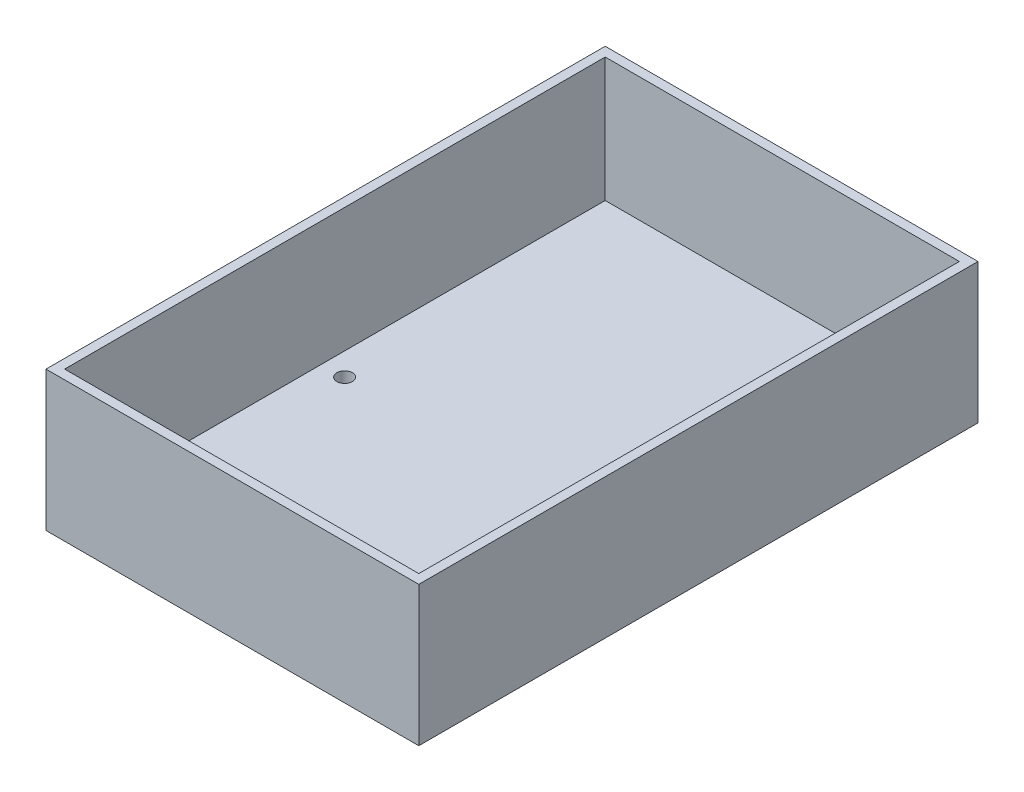
ISO-10303-21;
HEADER;
FILE_DESCRIPTION(('STEP AP214'),'2;1');
FILE_NAME('part.step','',(''),(''),'','','');
FILE_SCHEMA(('AUTOMOTIVE_DESIGN { 1 0 10303 214 1 1 1 1 }'));
ENDSEC;
DATA;
#1=APPLICATION_CONTEXT('core data for automotive mechanical design processes');
#2=APPLICATION_PROTOCOL_DEFINITION('international standard','automotive_design',2000,#1);
#3=PRODUCT_CONTEXT('',#1,'mechanical');
#4=PRODUCT('Part','Part','',(#3));
#5=PRODUCT_RELATED_PRODUCT_CATEGORY('part','',(#4));
#6=PRODUCT_DEFINITION_FORMATION('','',#4);
#7=PRODUCT_DEFINITION_CONTEXT('part definition',#1,'design');
#8=PRODUCT_DEFINITION('design','',#6,#7);
#9=PRODUCT_DEFINITION_SHAPE('','',#8);
#10=(LENGTH_UNIT() NAMED_UNIT(*) SI_UNIT(.MILLI.,.METRE.));
#11=(NAMED_UNIT(*) PLANE_ANGLE_UNIT() SI_UNIT($,.RADIAN.));
#12=(NAMED_UNIT(*) SI_UNIT($,.STERADIAN.) SOLID_ANGLE_UNIT());
#13=UNCERTAINTY_MEASURE_WITH_UNIT(LENGTH_MEASURE(1.E-05),#10,'distance_accuracy_value','');
#14=(GEOMETRIC_REPRESENTATION_CONTEXT(3) GLOBAL_UNCERTAINTY_ASSIGNED_CONTEXT((#13)) GLOBAL_UNIT_ASSIGNED_CONTEXT((#10,
#11,#12)) REPRESENTATION_CONTEXT('',''));
#15=CARTESIAN_POINT('',(0.,0.,0.));
#16=DIRECTION('',(0.,0.,1.));
#17=DIRECTION('',(1.,0.,0.));
#18=AXIS2_PLACEMENT_3D('',#15,#16,#17);
#19=CARTESIAN_POINT('',(0.,45.,0.));
#20=DIRECTION('',(1.,0.,0.));
#21=DIRECTION('',(0.,0.,-1.));
#22=AXIS2_PLACEMENT_3D('',#19,#20,#21);
#23=PLANE('',#22);
#24=DIRECTION('',(0.,0.,1.));
#25=VECTOR('',#24,1.);
#26=CARTESIAN_POINT('',(0.,0.,0.));
#27=LINE('',#26,#25);
#28=CARTESIAN_POINT('',(0.,0.,-180.));
#29=VERTEX_POINT('',#28);
#30=CARTESIAN_POINT('',(0.,0.,0.));
#31=VERTEX_POINT('',#30);
#32=EDGE_CURVE('E150',#29,#31,#27,.T.);
#33=ORIENTED_EDGE('',*,*,#32,.T.);
#34=DIRECTION('',(0.,-1.,0.));
#35=VECTOR('',#34,1.);
#36=CARTESIAN_POINT('',(0.,45.,0.));
#37=LINE('',#36,#35);
#38=CARTESIAN_POINT('',(0.,45.,0.));
#39=VERTEX_POINT('',#38);
#40=EDGE_CURVE('E11',#39,#31,#37,.T.);
#41=ORIENTED_EDGE('',*,*,#40,.F.);
#42=DIRECTION('',(0.,0.,1.));
#43=VECTOR('',#42,1.);
#44=CARTESIAN_POINT('',(0.,45.,0.));
#45=LINE('',#44,#43);
#46=CARTESIAN_POINT('',(0.,45.,-180.));
#47=VERTEX_POINT('',#46);
#48=EDGE_CURVE('E154',#47,#39,#45,.T.);
#49=ORIENTED_EDGE('',*,*,#48,.F.);
#50=DIRECTION('',(0.,-1.,0.));
#51=VECTOR('',#50,1.);
#52=CARTESIAN_POINT('',(0.,45.,-180.));
#53=LINE('',#52,#51);
#54=EDGE_CURVE('E160',#47,#29,#53,.T.);
#55=ORIENTED_EDGE('',*,*,#54,.T.);
#56=EDGE_LOOP('',(#33,#41,#49,#55));
#57=FACE_BOUND('',#56,.T.);
#58=ADVANCED_FACE('F38',(#57),#23,.F.);
#59=CARTESIAN_POINT('',(0.,45.,0.));
#60=DIRECTION('',(0.,0.,-1.));
#61=DIRECTION('',(-1.,0.,0.));
#62=AXIS2_PLACEMENT_3D('',#59,#60,#61);
#63=PLANE('',#62);
#64=DIRECTION('',(1.,0.,0.));
#65=VECTOR('',#64,1.);
#66=CARTESIAN_POINT('',(0.,0.,0.));
#67=LINE('',#66,#65);
#68=CARTESIAN_POINT('',(120.,0.,0.));
#69=VERTEX_POINT('',#68);
#70=EDGE_CURVE('E163',#31,#69,#67,.T.);
#71=ORIENTED_EDGE('',*,*,#70,.T.);
#72=DIRECTION('',(0.,-1.,0.));
#73=VECTOR('',#72,1.);
#74=CARTESIAN_POINT('',(120.,45.,0.));
#75=LINE('',#74,#73);
#76=CARTESIAN_POINT('',(120.,45.,0.));
#77=VERTEX_POINT('',#76);
#78=EDGE_CURVE('E45',#77,#69,#75,.T.);
#79=ORIENTED_EDGE('',*,*,#78,.F.);
#80=DIRECTION('',(1.,0.,0.));
#81=VECTOR('',#80,1.);
#82=CARTESIAN_POINT('',(0.,45.,0.));
#83=LINE('',#82,#81);
#84=EDGE_CURVE('E89',#39,#77,#83,.T.);
#85=ORIENTED_EDGE('',*,*,#84,.F.);
#86=ORIENTED_EDGE('',*,*,#40,.T.);
#87=EDGE_LOOP('',(#71,#79,#85,#86));
#88=FACE_BOUND('',#87,.T.);
#89=ADVANCED_FACE('F192',(#88),#63,.F.);
#90=CARTESIAN_POINT('',(120.,45.,0.));
#91=DIRECTION('',(-1.,0.,0.));
#92=DIRECTION('',(0.,0.,1.));
#93=AXIS2_PLACEMENT_3D('',#90,#91,#92);
#94=PLANE('',#93);
#95=DIRECTION('',(0.,0.,-1.));
#96=VECTOR('',#95,1.);
#97=CARTESIAN_POINT('',(120.,0.,0.));
#98=LINE('',#97,#96);
#99=CARTESIAN_POINT('',(120.,0.,-180.));
#100=VERTEX_POINT('',#99);
#101=EDGE_CURVE('E165',#69,#100,#98,.T.);
#102=ORIENTED_EDGE('',*,*,#101,.T.);
#103=DIRECTION('',(0.,-1.,0.));
#104=VECTOR('',#103,1.);
#105=CARTESIAN_POINT('',(120.,45.,-180.));
#106=LINE('',#105,#104);
#107=CARTESIAN_POINT('',(120.,45.,-180.));
#108=VERTEX_POINT('',#107);
#109=EDGE_CURVE('E169',#108,#100,#106,.T.);
#110=ORIENTED_EDGE('',*,*,#109,.F.);
#111=DIRECTION('',(0.,0.,-1.));
#112=VECTOR('',#111,1.);
#113=CARTESIAN_POINT('',(120.,45.,0.));
#114=LINE('',#113,#112);
#115=EDGE_CURVE('E157',#77,#108,#114,.T.);
#116=ORIENTED_EDGE('',*,*,#115,.F.);
#117=ORIENTED_EDGE('',*,*,#78,.T.);
#118=EDGE_LOOP('',(#102,#110,#116,#117));
#119=FACE_BOUND('',#118,.T.);
#120=ADVANCED_FACE('F174',(#119),#94,.F.);
#121=CARTESIAN_POINT('',(0.,45.,-180.));
#122=DIRECTION('',(0.,0.,1.));
#123=DIRECTION('',(1.,0.,0.));
#124=AXIS2_PLACEMENT_3D('',#121,#122,#123);
#125=PLANE('',#124);
#126=DIRECTION('',(-1.,0.,0.));
#127=VECTOR('',#126,1.);
#128=CARTESIAN_POINT('',(0.,0.,-180.));
#129=LINE('',#128,#127);
#130=EDGE_CURVE('E82',#100,#29,#129,.T.);
#131=ORIENTED_EDGE('',*,*,#130,.T.);
#132=ORIENTED_EDGE('',*,*,#54,.F.);
#133=DIRECTION('',(-1.,0.,0.));
#134=VECTOR('',#133,1.);
#135=CARTESIAN_POINT('',(0.,45.,-180.));
#136=LINE('',#135,#134);
#137=EDGE_CURVE('E61',#108,#47,#136,.T.);
#138=ORIENTED_EDGE('',*,*,#137,.F.);
#139=ORIENTED_EDGE('',*,*,#109,.T.);
#140=EDGE_LOOP('',(#131,#132,#138,#139));
#141=FACE_BOUND('',#140,.T.);
#142=ADVANCED_FACE('F182',(#141),#125,.F.);
#143=CARTESIAN_POINT('',(0.,45.,0.));
#144=DIRECTION('',(0.,-1.,0.));
#145=DIRECTION('',(0.,0.,-1.));
#146=AXIS2_PLACEMENT_3D('',#143,#144,#145);
#147=PLANE('',#146);
#148=DIRECTION('',(0.,0.,1.));
#149=VECTOR('',#148,1.);
#150=CARTESIAN_POINT('',(2.99999999999999,45.,-177.));
#151=LINE('',#150,#149);
#152=CARTESIAN_POINT('',(2.99999999999999,45.,-177.));
#153=VERTEX_POINT('',#152);
#154=CARTESIAN_POINT('',(3.,45.,-3.));
#155=VERTEX_POINT('',#154);
#156=EDGE_CURVE('E143',#153,#155,#151,.T.);
#157=ORIENTED_EDGE('',*,*,#156,.F.);
#158=DIRECTION('',(-1.,0.,0.));
#159=VECTOR('',#158,1.);
#160=CARTESIAN_POINT('',(117.,45.,-177.));
#161=LINE('',#160,#159);
#162=CARTESIAN_POINT('',(117.,45.,-177.));
#163=VERTEX_POINT('',#162);
#164=EDGE_CURVE('E52',#163,#153,#161,.T.);
#165=ORIENTED_EDGE('',*,*,#164,.F.);
#166=DIRECTION('',(0.,0.,-1.));
#167=VECTOR('',#166,1.);
#168=CARTESIAN_POINT('',(117.,45.,-3.));
#169=LINE('',#168,#167);
#170=CARTESIAN_POINT('',(117.,45.,-3.));
#171=VERTEX_POINT('',#170);
#172=EDGE_CURVE('E131',#171,#163,#169,.T.);
#173=ORIENTED_EDGE('',*,*,#172,.F.);
#174=DIRECTION('',(1.,0.,0.));
#175=VECTOR('',#174,1.);
#176=CARTESIAN_POINT('',(3.,45.,-3.));
#177=LINE('',#176,#175);
#178=EDGE_CURVE('E134',#155,#171,#177,.T.);
#179=ORIENTED_EDGE('',*,*,#178,.F.);
#180=EDGE_LOOP('',(#157,#165,#173,#179));
#181=FACE_BOUND('',#180,.T.);
#182=ORIENTED_EDGE('',*,*,#48,.T.);
#183=ORIENTED_EDGE('',*,*,#84,.T.);
#184=ORIENTED_EDGE('',*,*,#115,.T.);
#185=ORIENTED_EDGE('',*,*,#137,.T.);
#186=EDGE_LOOP('',(#182,#183,#184,#185));
#187=FACE_BOUND('',#186,.T.);
#188=ADVANCED_FACE('F184',(#181,#187),#147,.F.);
#189=CARTESIAN_POINT('',(0.,0.,0.));
#190=DIRECTION('',(0.,-1.,0.));
#191=DIRECTION('',(0.,0.,-1.));
#192=AXIS2_PLACEMENT_3D('',#189,#190,#191);
#193=PLANE('',#192);
#194=CARTESIAN_POINT('',(10.3,0.,-85.8186368222107));
#195=DIRECTION('',(0.,1.,0.));
#196=DIRECTION('',(0.,0.,1.));
#197=AXIS2_PLACEMENT_3D('',#194,#195,#196);
#198=CIRCLE('',#197,2.5);
#199=CARTESIAN_POINT('',(10.3,0.,-83.3186368222107));
#200=VERTEX_POINT('',#199);
#201=EDGE_CURVE('E144',#200,#200,#198,.T.);
#202=ORIENTED_EDGE('',*,*,#201,.T.);
#203=EDGE_LOOP('',(#202));
#204=FACE_BOUND('',#203,.T.);
#205=CARTESIAN_POINT('',(60.,0.,-7.));
#206=DIRECTION('',(0.,1.,0.));
#207=DIRECTION('',(0.,0.,1.));
#208=AXIS2_PLACEMENT_3D('',#205,#206,#207);
#209=CIRCLE('',#208,2.5);
#210=CARTESIAN_POINT('',(60.,0.,-4.5));
#211=VERTEX_POINT('',#210);
#212=EDGE_CURVE('E294',#211,#211,#209,.T.);
#213=ORIENTED_EDGE('',*,*,#212,.T.);
#214=EDGE_LOOP('',(#213));
#215=FACE_BOUND('',#214,.T.);
#216=ORIENTED_EDGE('',*,*,#32,.F.);
#217=ORIENTED_EDGE('',*,*,#130,.F.);
#218=ORIENTED_EDGE('',*,*,#101,.F.);
#219=ORIENTED_EDGE('',*,*,#70,.F.);
#220=EDGE_LOOP('',(#216,#217,#218,#219));
#221=FACE_BOUND('',#220,.T.);
#222=ADVANCED_FACE('F178',(#204,#215,#221),#193,.T.);
#223=CARTESIAN_POINT('',(117.,5.,-177.));
#224=DIRECTION('',(0.,0.,-1.));
#225=DIRECTION('',(-1.,0.,0.));
#226=AXIS2_PLACEMENT_3D('',#223,#224,#225);
#227=PLANE('',#226);
#228=ORIENTED_EDGE('',*,*,#164,.T.);
#229=DIRECTION('',(0.,1.,0.));
#230=VECTOR('',#229,1.);
#231=CARTESIAN_POINT('',(2.99999999999999,5.,-177.));
#232=LINE('',#231,#230);
#233=CARTESIAN_POINT('',(2.99999999999999,5.,-177.));
#234=VERTEX_POINT('',#233);
#235=EDGE_CURVE('E109',#234,#153,#232,.T.);
#236=ORIENTED_EDGE('',*,*,#235,.F.);
#237=DIRECTION('',(-1.,0.,0.));
#238=VECTOR('',#237,1.);
#239=CARTESIAN_POINT('',(117.,5.,-177.));
#240=LINE('',#239,#238);
#241=CARTESIAN_POINT('',(117.,5.,-177.));
#242=VERTEX_POINT('',#241);
#243=EDGE_CURVE('E113',#242,#234,#240,.T.);
#244=ORIENTED_EDGE('',*,*,#243,.F.);
#245=DIRECTION('',(0.,1.,0.));
#246=VECTOR('',#245,1.);
#247=CARTESIAN_POINT('',(117.,5.,-177.));
#248=LINE('',#247,#246);
#249=EDGE_CURVE('E148',#242,#163,#248,.T.);
#250=ORIENTED_EDGE('',*,*,#249,.T.);
#251=EDGE_LOOP('',(#228,#236,#244,#250));
#252=FACE_BOUND('',#251,.T.);
#253=ADVANCED_FACE('F111',(#252),#227,.F.);
#254=CARTESIAN_POINT('',(117.,5.,-3.));
#255=DIRECTION('',(1.,0.,0.));
#256=DIRECTION('',(0.,0.,-1.));
#257=AXIS2_PLACEMENT_3D('',#254,#255,#256);
#258=PLANE('',#257);
#259=ORIENTED_EDGE('',*,*,#172,.T.);
#260=ORIENTED_EDGE('',*,*,#249,.F.);
#261=DIRECTION('',(0.,0.,-1.));
#262=VECTOR('',#261,1.);
#263=CARTESIAN_POINT('',(117.,5.,-3.));
#264=LINE('',#263,#262);
#265=CARTESIAN_POINT('',(117.,5.,-3.));
#266=VERTEX_POINT('',#265);
#267=EDGE_CURVE('E119',#266,#242,#264,.T.);
#268=ORIENTED_EDGE('',*,*,#267,.F.);
#269=DIRECTION('',(0.,1.,0.));
#270=VECTOR('',#269,1.);
#271=CARTESIAN_POINT('',(117.,5.,-3.));
#272=LINE('',#271,#270);
#273=EDGE_CURVE('E151',#266,#171,#272,.T.);
#274=ORIENTED_EDGE('',*,*,#273,.T.);
#275=EDGE_LOOP('',(#259,#260,#268,#274));
#276=FACE_BOUND('',#275,.T.);
#277=ADVANCED_FACE('F226',(#276),#258,.F.);
#278=CARTESIAN_POINT('',(3.,5.,-3.));
#279=DIRECTION('',(0.,0.,1.));
#280=DIRECTION('',(1.,0.,0.));
#281=AXIS2_PLACEMENT_3D('',#278,#279,#280);
#282=PLANE('',#281);
#283=ORIENTED_EDGE('',*,*,#178,.T.);
#284=ORIENTED_EDGE('',*,*,#273,.F.);
#285=DIRECTION('',(1.,0.,0.));
#286=VECTOR('',#285,1.);
#287=CARTESIAN_POINT('',(3.,5.,-3.));
#288=LINE('',#287,#286);
#289=CARTESIAN_POINT('',(3.,5.,-3.));
#290=VERTEX_POINT('',#289);
#291=EDGE_CURVE('E127',#290,#266,#288,.T.);
#292=ORIENTED_EDGE('',*,*,#291,.F.);
#293=DIRECTION('',(0.,1.,0.));
#294=VECTOR('',#293,1.);
#295=CARTESIAN_POINT('',(3.,5.,-3.));
#296=LINE('',#295,#294);
#297=EDGE_CURVE('E118',#290,#155,#296,.T.);
#298=ORIENTED_EDGE('',*,*,#297,.T.);
#299=EDGE_LOOP('',(#283,#284,#292,#298));
#300=FACE_BOUND('',#299,.T.);
#301=ADVANCED_FACE('F235',(#300),#282,.F.);
#302=CARTESIAN_POINT('',(2.99999999999999,5.,-177.));
#303=DIRECTION('',(-1.,0.,0.));
#304=DIRECTION('',(0.,0.,1.));
#305=AXIS2_PLACEMENT_3D('',#302,#303,#304);
#306=PLANE('',#305);
#307=ORIENTED_EDGE('',*,*,#156,.T.);
#308=ORIENTED_EDGE('',*,*,#297,.F.);
#309=DIRECTION('',(0.,0.,1.));
#310=VECTOR('',#309,1.);
#311=CARTESIAN_POINT('',(2.99999999999999,5.,-177.));
#312=LINE('',#311,#310);
#313=EDGE_CURVE('E122',#234,#290,#312,.T.);
#314=ORIENTED_EDGE('',*,*,#313,.F.);
#315=ORIENTED_EDGE('',*,*,#235,.T.);
#316=EDGE_LOOP('',(#307,#308,#314,#315));
#317=FACE_BOUND('',#316,.T.);
#318=ADVANCED_FACE('F123',(#317),#306,.F.);
#319=CARTESIAN_POINT('',(0.,5.,0.));
#320=DIRECTION('',(0.,1.,0.));
#321=DIRECTION('',(0.,0.,1.));
#322=AXIS2_PLACEMENT_3D('',#319,#320,#321);
#323=PLANE('',#322);
#324=CARTESIAN_POINT('',(10.3,5.,-85.8186368222107));
#325=DIRECTION('',(0.,1.,0.));
#326=DIRECTION('',(0.,0.,1.));
#327=AXIS2_PLACEMENT_3D('',#324,#325,#326);
#328=CIRCLE('',#327,2.5);
#329=CARTESIAN_POINT('',(10.3,5.,-83.3186368222107));
#330=VERTEX_POINT('',#329);
#331=EDGE_CURVE('E293',#330,#330,#328,.T.);
#332=ORIENTED_EDGE('',*,*,#331,.F.);
#333=EDGE_LOOP('',(#332));
#334=FACE_BOUND('',#333,.T.);
#335=CARTESIAN_POINT('',(60.,5.,-7.));
#336=DIRECTION('',(0.,1.,0.));
#337=DIRECTION('',(0.,0.,1.));
#338=AXIS2_PLACEMENT_3D('',#335,#336,#337);
#339=CIRCLE('',#338,2.5);
#340=CARTESIAN_POINT('',(60.,5.,-4.5));
#341=VERTEX_POINT('',#340);
#342=EDGE_CURVE('E137',#341,#341,#339,.T.);
#343=ORIENTED_EDGE('',*,*,#342,.F.);
#344=EDGE_LOOP('',(#343));
#345=FACE_BOUND('',#344,.T.);
#346=ORIENTED_EDGE('',*,*,#243,.T.);
#347=ORIENTED_EDGE('',*,*,#313,.T.);
#348=ORIENTED_EDGE('',*,*,#291,.T.);
#349=ORIENTED_EDGE('',*,*,#267,.T.);
#350=EDGE_LOOP('',(#346,#347,#348,#349));
#351=FACE_BOUND('',#350,.T.);
#352=ADVANCED_FACE('F129',(#334,#345,#351),#323,.T.);
#353=CARTESIAN_POINT('',(60.,0.,-7.));
#354=DIRECTION('',(0.,1.,0.));
#355=DIRECTION('',(0.,0.,1.));
#356=AXIS2_PLACEMENT_3D('',#353,#354,#355);
#357=CYLINDRICAL_SURFACE('',#356,2.5);
#358=ORIENTED_EDGE('',*,*,#212,.F.);
#359=EDGE_LOOP('',(#358));
#360=FACE_BOUND('',#359,.T.);
#361=ORIENTED_EDGE('',*,*,#342,.T.);
#362=EDGE_LOOP('',(#361));
#363=FACE_BOUND('',#362,.T.);
#364=ADVANCED_FACE('F266',(#360,#363),#357,.F.);
#365=CARTESIAN_POINT('',(10.3,0.,-85.8186368222107));
#366=DIRECTION('',(0.,1.,0.));
#367=DIRECTION('',(0.,0.,1.));
#368=AXIS2_PLACEMENT_3D('',#365,#366,#367);
#369=CYLINDRICAL_SURFACE('',#368,2.5);
#370=ORIENTED_EDGE('',*,*,#201,.F.);
#371=EDGE_LOOP('',(#370));
#372=FACE_BOUND('',#371,.T.);
#373=ORIENTED_EDGE('',*,*,#331,.T.);
#374=EDGE_LOOP('',(#373));
#375=FACE_BOUND('',#374,.T.);
#376=ADVANCED_FACE('F274',(#372,#375),#369,.F.);
#377=CLOSED_SHELL('',(#58,#89,#120,#142,#188,#222,#253,#277,#301,#318,#352,#364,#376));
#378=MANIFOLD_SOLID_BREP('B2',#377);
#379=ADVANCED_BREP_SHAPE_REPRESENTATION('',(#18,#378),#14);
#380=SHAPE_DEFINITION_REPRESENTATION(#9,#379);
ENDSEC;
END-ISO-10303-21;
